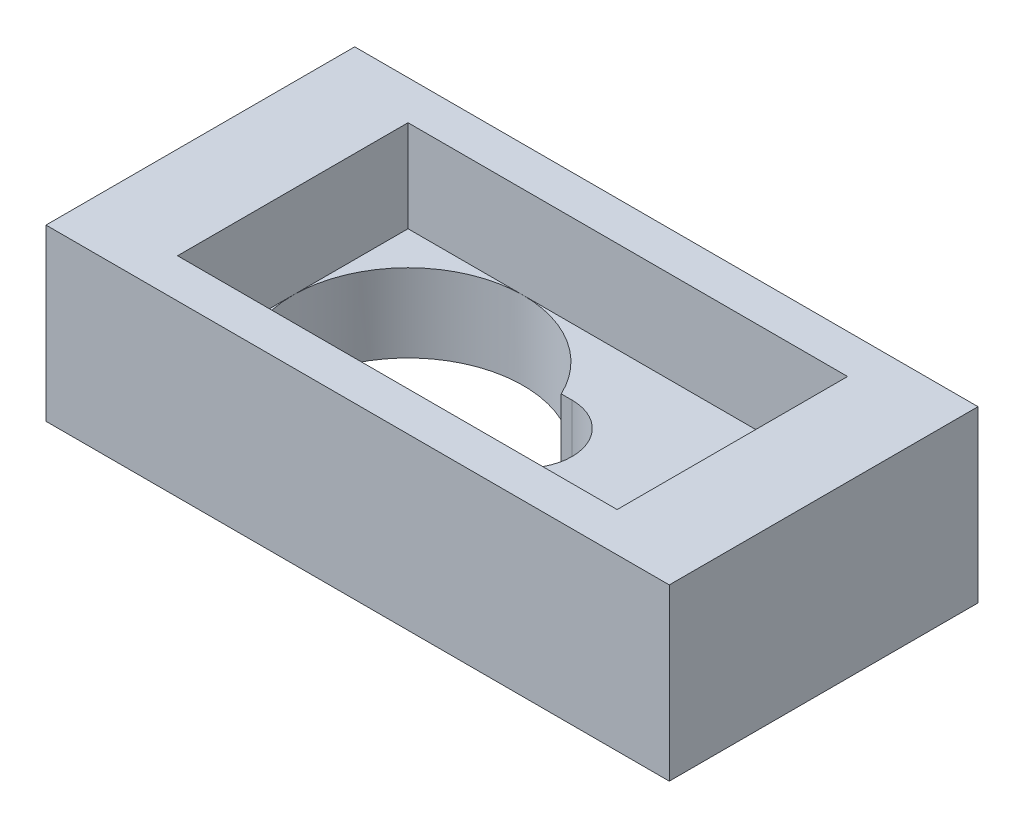
ISO-10303-21;
HEADER;
FILE_DESCRIPTION(('STEP AP214'),'2;1');
FILE_NAME('part.step','',(''),(''),'','','');
FILE_SCHEMA(('AUTOMOTIVE_DESIGN { 1 0 10303 214 1 1 1 1 }'));
ENDSEC;
DATA;
#1=APPLICATION_CONTEXT('core data for automotive mechanical design processes');
#2=APPLICATION_PROTOCOL_DEFINITION('international standard','automotive_design',2000,#1);
#3=PRODUCT_CONTEXT('',#1,'mechanical');
#4=PRODUCT('Part','Part','',(#3));
#5=PRODUCT_RELATED_PRODUCT_CATEGORY('part','',(#4));
#6=PRODUCT_DEFINITION_FORMATION('','',#4);
#7=PRODUCT_DEFINITION_CONTEXT('part definition',#1,'design');
#8=PRODUCT_DEFINITION('design','',#6,#7);
#9=PRODUCT_DEFINITION_SHAPE('','',#8);
#10=(LENGTH_UNIT() NAMED_UNIT(*) SI_UNIT(.MILLI.,.METRE.));
#11=(NAMED_UNIT(*) PLANE_ANGLE_UNIT() SI_UNIT($,.RADIAN.));
#12=(NAMED_UNIT(*) SI_UNIT($,.STERADIAN.) SOLID_ANGLE_UNIT());
#13=UNCERTAINTY_MEASURE_WITH_UNIT(LENGTH_MEASURE(1.E-05),#10,'distance_accuracy_value','');
#14=(GEOMETRIC_REPRESENTATION_CONTEXT(3) GLOBAL_UNCERTAINTY_ASSIGNED_CONTEXT((#13)) GLOBAL_UNIT_ASSIGNED_CONTEXT((#10,
#11,#12)) REPRESENTATION_CONTEXT('',''));
#15=CARTESIAN_POINT('',(0.,0.,0.));
#16=DIRECTION('',(0.,0.,1.));
#17=DIRECTION('',(1.,0.,0.));
#18=AXIS2_PLACEMENT_3D('',#15,#16,#17);
#19=CARTESIAN_POINT('',(0.,4.,0.));
#20=DIRECTION('',(0.,1.,0.));
#21=DIRECTION('',(0.,0.,1.));
#22=AXIS2_PLACEMENT_3D('',#19,#20,#21);
#23=PLANE('',#22);
#24=DIRECTION('',(0.,0.,-1.));
#25=VECTOR('',#24,1.);
#26=CARTESIAN_POINT('',(9.70427981122599,4.,5.99880623790041));
#27=LINE('',#26,#25);
#28=CARTESIAN_POINT('',(9.70427981122599,4.,5.99880623790041));
#29=VERTEX_POINT('',#28);
#30=CARTESIAN_POINT('',(9.70427981122599,4.,-5.79605424270867));
#31=VERTEX_POINT('',#30);
#32=EDGE_CURVE('E151',#29,#31,#27,.T.);
#33=ORIENTED_EDGE('',*,*,#32,.T.);
#34=DIRECTION('',(-1.,0.,0.));
#35=VECTOR('',#34,1.);
#36=CARTESIAN_POINT('',(-6.89572018877401,4.,-5.79605424270866));
#37=LINE('',#36,#35);
#38=CARTESIAN_POINT('',(-6.89572018877399,4.,-5.79605424270866));
#39=VERTEX_POINT('',#38);
#40=EDGE_CURVE('E52',#31,#39,#37,.T.);
#41=ORIENTED_EDGE('',*,*,#40,.T.);
#42=CARTESIAN_POINT('',(-6.89572018877399,4.,0.101375997595874));
#43=DIRECTION('',(0.,1.,0.));
#44=DIRECTION('',(0.,0.,1.));
#45=AXIS2_PLACEMENT_3D('',#42,#43,#44);
#46=CIRCLE('',#45,5.89743024030454);
#47=CARTESIAN_POINT('',(-1.5544016774644,4.,-2.39862400240413));
#48=VERTEX_POINT('',#47);
#49=EDGE_CURVE('E199',#48,#39,#46,.T.);
#50=ORIENTED_EDGE('',*,*,#49,.F.);
#51=DIRECTION('',(-1.,0.,0.));
#52=VECTOR('',#51,1.);
#53=CARTESIAN_POINT('',(-0.998289948469448,4.,-2.39862400240413));
#54=LINE('',#53,#52);
#55=CARTESIAN_POINT('',(-0.998289948469448,4.,-2.39862400240413));
#56=VERTEX_POINT('',#55);
#57=EDGE_CURVE('E196',#56,#48,#54,.T.);
#58=ORIENTED_EDGE('',*,*,#57,.F.);
#59=CARTESIAN_POINT('',(-0.998289948469448,4.,0.101375997595873));
#60=DIRECTION('',(0.,1.,0.));
#61=DIRECTION('',(0.,0.,1.));
#62=AXIS2_PLACEMENT_3D('',#59,#60,#61);
#63=CIRCLE('',#62,2.5);
#64=CARTESIAN_POINT('',(-0.998289948469448,4.,2.60137599759587));
#65=VERTEX_POINT('',#64);
#66=EDGE_CURVE('E194',#65,#56,#63,.T.);
#67=ORIENTED_EDGE('',*,*,#66,.F.);
#68=DIRECTION('',(1.,0.,0.));
#69=VECTOR('',#68,1.);
#70=CARTESIAN_POINT('',(-0.998289948469448,4.,2.60137599759587));
#71=LINE('',#70,#69);
#72=CARTESIAN_POINT('',(-1.5544016774644,4.,2.60137599759587));
#73=VERTEX_POINT('',#72);
#74=EDGE_CURVE('E202',#73,#65,#71,.T.);
#75=ORIENTED_EDGE('',*,*,#74,.F.);
#76=CARTESIAN_POINT('',(-6.89572018877399,4.,5.99880623790041));
#77=VERTEX_POINT('',#76);
#78=EDGE_CURVE('E66',#77,#73,#46,.T.);
#79=ORIENTED_EDGE('',*,*,#78,.F.);
#80=DIRECTION('',(1.,0.,0.));
#81=VECTOR('',#80,1.);
#82=CARTESIAN_POINT('',(-6.89572018877393,4.,5.99880623790041));
#83=LINE('',#82,#81);
#84=EDGE_CURVE('E175',#77,#29,#83,.T.);
#85=ORIENTED_EDGE('',*,*,#84,.T.);
#86=EDGE_LOOP('',(#33,#41,#50,#58,#67,#75,#79,#85));
#87=FACE_BOUND('',#86,.T.);
#88=ADVANCED_FACE('F41',(#87),#23,.T.);
#89=CARTESIAN_POINT('',(-12.7931504290785,4.,0.101375997595874));
#90=VERTEX_POINT('',#89);
#91=EDGE_CURVE('E203',#39,#90,#46,.T.);
#92=ORIENTED_EDGE('',*,*,#91,.F.);
#93=CARTESIAN_POINT('',(-12.7931504290785,4.,-5.79605424270866));
#94=VERTEX_POINT('',#93);
#95=EDGE_CURVE('E11',#39,#94,#37,.T.);
#96=ORIENTED_EDGE('',*,*,#95,.T.);
#97=DIRECTION('',(0.,0.,1.));
#98=VECTOR('',#97,1.);
#99=CARTESIAN_POINT('',(-12.7931504290785,4.,0.101375997595876));
#100=LINE('',#99,#98);
#101=EDGE_CURVE('E158',#94,#90,#100,.T.);
#102=ORIENTED_EDGE('',*,*,#101,.T.);
#103=EDGE_LOOP('',(#92,#96,#102));
#104=FACE_BOUND('',#103,.T.);
#105=ADVANCED_FACE('F258',(#104),#23,.T.);
#106=EDGE_CURVE('E254',#90,#77,#46,.T.);
#107=ORIENTED_EDGE('',*,*,#106,.F.);
#108=CARTESIAN_POINT('',(-12.7931504290785,4.,5.99880623790041));
#109=VERTEX_POINT('',#108);
#110=EDGE_CURVE('E50',#90,#109,#100,.T.);
#111=ORIENTED_EDGE('',*,*,#110,.T.);
#112=EDGE_CURVE('E172',#109,#77,#83,.T.);
#113=ORIENTED_EDGE('',*,*,#112,.T.);
#114=EDGE_LOOP('',(#107,#111,#113));
#115=FACE_BOUND('',#114,.T.);
#116=ADVANCED_FACE('F253',(#115),#23,.T.);
#117=CARTESIAN_POINT('',(0.,0.,0.));
#118=DIRECTION('',(0.,1.,0.));
#119=DIRECTION('',(0.,0.,1.));
#120=AXIS2_PLACEMENT_3D('',#117,#118,#119);
#121=PLANE('',#120);
#122=DIRECTION('',(0.,0.,-1.));
#123=VECTOR('',#122,1.);
#124=CARTESIAN_POINT('',(14.378787795047,0.,-5.79605424270866));
#125=LINE('',#124,#123);
#126=CARTESIAN_POINT('',(14.378787795047,0.,8.00394575729134));
#127=VERTEX_POINT('',#126);
#128=CARTESIAN_POINT('',(14.378787795047,0.,-7.79605424270866));
#129=VERTEX_POINT('',#128);
#130=EDGE_CURVE('E225',#127,#129,#125,.T.);
#131=ORIENTED_EDGE('',*,*,#130,.F.);
#132=DIRECTION('',(1.,0.,0.));
#133=VECTOR('',#132,1.);
#134=CARTESIAN_POINT('',(-17.521212204953,0.,8.00394575729134));
#135=LINE('',#134,#133);
#136=CARTESIAN_POINT('',(-17.521212204953,0.,8.00394575729134));
#137=VERTEX_POINT('',#136);
#138=EDGE_CURVE('E232',#137,#127,#135,.T.);
#139=ORIENTED_EDGE('',*,*,#138,.F.);
#140=DIRECTION('',(0.,0.,1.));
#141=VECTOR('',#140,1.);
#142=CARTESIAN_POINT('',(-17.521212204953,0.,6.00394575729134));
#143=LINE('',#142,#141);
#144=CARTESIAN_POINT('',(-17.521212204953,0.,-7.79605424270866));
#145=VERTEX_POINT('',#144);
#146=EDGE_CURVE('E230',#145,#137,#143,.T.);
#147=ORIENTED_EDGE('',*,*,#146,.F.);
#148=DIRECTION('',(-1.,0.,0.));
#149=VECTOR('',#148,1.);
#150=CARTESIAN_POINT('',(-17.521212204953,0.,-7.79605424270866));
#151=LINE('',#150,#149);
#152=EDGE_CURVE('E227',#129,#145,#151,.T.);
#153=ORIENTED_EDGE('',*,*,#152,.F.);
#154=EDGE_LOOP('',(#131,#139,#147,#153));
#155=FACE_BOUND('',#154,.T.);
#156=CARTESIAN_POINT('',(-0.998289948469448,0.,0.101375997595873));
#157=DIRECTION('',(0.,1.,0.));
#158=DIRECTION('',(0.,0.,1.));
#159=AXIS2_PLACEMENT_3D('',#156,#157,#158);
#160=CIRCLE('',#159,2.5);
#161=CARTESIAN_POINT('',(-0.998289948469448,0.,2.60137599759587));
#162=VERTEX_POINT('',#161);
#163=CARTESIAN_POINT('',(-0.998289948469448,0.,-2.39862400240413));
#164=VERTEX_POINT('',#163);
#165=EDGE_CURVE('E193',#162,#164,#160,.T.);
#166=ORIENTED_EDGE('',*,*,#165,.T.);
#167=DIRECTION('',(-1.,0.,0.));
#168=VECTOR('',#167,1.);
#169=CARTESIAN_POINT('',(-0.998289948469448,0.,-2.39862400240413));
#170=LINE('',#169,#168);
#171=CARTESIAN_POINT('',(-1.5544016774644,0.,-2.39862400240413));
#172=VERTEX_POINT('',#171);
#173=EDGE_CURVE('E208',#164,#172,#170,.T.);
#174=ORIENTED_EDGE('',*,*,#173,.T.);
#175=CARTESIAN_POINT('',(-6.89572018877399,0.,0.101375997595874));
#176=DIRECTION('',(0.,1.,0.));
#177=DIRECTION('',(0.,0.,1.));
#178=AXIS2_PLACEMENT_3D('',#175,#176,#177);
#179=CIRCLE('',#178,5.89743024030454);
#180=CARTESIAN_POINT('',(-1.5544016774644,0.,2.60137599759587));
#181=VERTEX_POINT('',#180);
#182=EDGE_CURVE('E211',#172,#181,#179,.T.);
#183=ORIENTED_EDGE('',*,*,#182,.T.);
#184=DIRECTION('',(1.,0.,0.));
#185=VECTOR('',#184,1.);
#186=CARTESIAN_POINT('',(-0.998289948469448,0.,2.60137599759587));
#187=LINE('',#186,#185);
#188=EDGE_CURVE('E197',#181,#162,#187,.T.);
#189=ORIENTED_EDGE('',*,*,#188,.T.);
#190=EDGE_LOOP('',(#166,#174,#183,#189));
#191=FACE_BOUND('',#190,.T.);
#192=ADVANCED_FACE('F282',(#155,#191),#121,.F.);
#193=CARTESIAN_POINT('',(14.378787795047,4.,-5.79605424270866));
#194=DIRECTION('',(-1.,0.,0.));
#195=DIRECTION('',(0.,0.,1.));
#196=AXIS2_PLACEMENT_3D('',#193,#194,#195);
#197=PLANE('',#196);
#198=ORIENTED_EDGE('',*,*,#130,.T.);
#199=DIRECTION('',(0.,-1.,0.));
#200=VECTOR('',#199,1.);
#201=CARTESIAN_POINT('',(14.378787795047,4.,-7.79605424270866));
#202=LINE('',#201,#200);
#203=CARTESIAN_POINT('',(14.378787795047,8.7,-7.79605424270866));
#204=VERTEX_POINT('',#203);
#205=EDGE_CURVE('E45',#204,#129,#202,.T.);
#206=ORIENTED_EDGE('',*,*,#205,.F.);
#207=DIRECTION('',(0.,0.,-1.));
#208=VECTOR('',#207,1.);
#209=CARTESIAN_POINT('',(14.378787795047,8.7,-7.79605424270866));
#210=LINE('',#209,#208);
#211=CARTESIAN_POINT('',(14.378787795047,8.7,8.00394575729134));
#212=VERTEX_POINT('',#211);
#213=EDGE_CURVE('E187',#212,#204,#210,.T.);
#214=ORIENTED_EDGE('',*,*,#213,.F.);
#215=DIRECTION('',(0.,-1.,0.));
#216=VECTOR('',#215,1.);
#217=CARTESIAN_POINT('',(14.378787795047,4.,8.00394575729134));
#218=LINE('',#217,#216);
#219=EDGE_CURVE('E235',#212,#127,#218,.T.);
#220=ORIENTED_EDGE('',*,*,#219,.T.);
#221=EDGE_LOOP('',(#198,#206,#214,#220));
#222=FACE_BOUND('',#221,.T.);
#223=ADVANCED_FACE('F43',(#222),#197,.F.);
#224=CARTESIAN_POINT('',(-17.521212204953,4.,-7.79605424270866));
#225=DIRECTION('',(0.,0.,1.));
#226=DIRECTION('',(1.,0.,0.));
#227=AXIS2_PLACEMENT_3D('',#224,#225,#226);
#228=PLANE('',#227);
#229=ORIENTED_EDGE('',*,*,#152,.T.);
#230=DIRECTION('',(0.,-1.,0.));
#231=VECTOR('',#230,1.);
#232=CARTESIAN_POINT('',(-17.521212204953,4.,-7.79605424270866));
#233=LINE('',#232,#231);
#234=CARTESIAN_POINT('',(-17.521212204953,8.7,-7.79605424270866));
#235=VERTEX_POINT('',#234);
#236=EDGE_CURVE('E240',#235,#145,#233,.T.);
#237=ORIENTED_EDGE('',*,*,#236,.F.);
#238=DIRECTION('',(-1.,0.,0.));
#239=VECTOR('',#238,1.);
#240=CARTESIAN_POINT('',(-17.521212204953,8.7,-7.79605424270866));
#241=LINE('',#240,#239);
#242=EDGE_CURVE('E190',#204,#235,#241,.T.);
#243=ORIENTED_EDGE('',*,*,#242,.F.);
#244=ORIENTED_EDGE('',*,*,#205,.T.);
#245=EDGE_LOOP('',(#229,#237,#243,#244));
#246=FACE_BOUND('',#245,.T.);
#247=ADVANCED_FACE('F290',(#246),#228,.F.);
#248=CARTESIAN_POINT('',(-17.521212204953,4.,6.00394575729134));
#249=DIRECTION('',(1.,0.,0.));
#250=DIRECTION('',(0.,0.,-1.));
#251=AXIS2_PLACEMENT_3D('',#248,#249,#250);
#252=PLANE('',#251);
#253=ORIENTED_EDGE('',*,*,#146,.T.);
#254=DIRECTION('',(0.,-1.,0.));
#255=VECTOR('',#254,1.);
#256=CARTESIAN_POINT('',(-17.521212204953,4.,8.00394575729134));
#257=LINE('',#256,#255);
#258=CARTESIAN_POINT('',(-17.521212204953,8.7,8.00394575729134));
#259=VERTEX_POINT('',#258);
#260=EDGE_CURVE('E238',#259,#137,#257,.T.);
#261=ORIENTED_EDGE('',*,*,#260,.F.);
#262=DIRECTION('',(0.,0.,1.));
#263=VECTOR('',#262,1.);
#264=CARTESIAN_POINT('',(-17.521212204953,8.7,-7.79605424270866));
#265=LINE('',#264,#263);
#266=EDGE_CURVE('E159',#235,#259,#265,.T.);
#267=ORIENTED_EDGE('',*,*,#266,.F.);
#268=ORIENTED_EDGE('',*,*,#236,.T.);
#269=EDGE_LOOP('',(#253,#261,#267,#268));
#270=FACE_BOUND('',#269,.T.);
#271=ADVANCED_FACE('F298',(#270),#252,.F.);
#272=CARTESIAN_POINT('',(-17.521212204953,4.,8.00394575729134));
#273=DIRECTION('',(0.,0.,-1.));
#274=DIRECTION('',(-1.,0.,0.));
#275=AXIS2_PLACEMENT_3D('',#272,#273,#274);
#276=PLANE('',#275);
#277=ORIENTED_EDGE('',*,*,#138,.T.);
#278=ORIENTED_EDGE('',*,*,#219,.F.);
#279=DIRECTION('',(1.,0.,0.));
#280=VECTOR('',#279,1.);
#281=CARTESIAN_POINT('',(-17.521212204953,8.7,8.00394575729134));
#282=LINE('',#281,#280);
#283=EDGE_CURVE('E184',#259,#212,#282,.T.);
#284=ORIENTED_EDGE('',*,*,#283,.F.);
#285=ORIENTED_EDGE('',*,*,#260,.T.);
#286=EDGE_LOOP('',(#277,#278,#284,#285));
#287=FACE_BOUND('',#286,.T.);
#288=ADVANCED_FACE('F294',(#287),#276,.F.);
#289=CARTESIAN_POINT('',(-0.998289948469448,4.,0.101375997595873));
#290=DIRECTION('',(0.,-1.,0.));
#291=DIRECTION('',(0.,0.,-1.));
#292=AXIS2_PLACEMENT_3D('',#289,#290,#291);
#293=CYLINDRICAL_SURFACE('',#292,2.5);
#294=ORIENTED_EDGE('',*,*,#165,.F.);
#295=DIRECTION('',(0.,-1.,0.));
#296=VECTOR('',#295,1.);
#297=CARTESIAN_POINT('',(-0.998289948469448,4.,2.60137599759587));
#298=LINE('',#297,#296);
#299=EDGE_CURVE('E205',#65,#162,#298,.T.);
#300=ORIENTED_EDGE('',*,*,#299,.F.);
#301=ORIENTED_EDGE('',*,*,#66,.T.);
#302=DIRECTION('',(0.,-1.,0.));
#303=VECTOR('',#302,1.);
#304=CARTESIAN_POINT('',(-0.998289948469448,4.,-2.39862400240413));
#305=LINE('',#304,#303);
#306=EDGE_CURVE('E222',#56,#164,#305,.T.);
#307=ORIENTED_EDGE('',*,*,#306,.T.);
#308=EDGE_LOOP('',(#294,#300,#301,#307));
#309=FACE_BOUND('',#308,.T.);
#310=ADVANCED_FACE('F297',(#309),#293,.F.);
#311=CARTESIAN_POINT('',(-0.998289948469448,4.,-2.39862400240413));
#312=DIRECTION('',(0.,0.,1.));
#313=DIRECTION('',(1.,0.,0.));
#314=AXIS2_PLACEMENT_3D('',#311,#312,#313);
#315=PLANE('',#314);
#316=ORIENTED_EDGE('',*,*,#173,.F.);
#317=ORIENTED_EDGE('',*,*,#306,.F.);
#318=ORIENTED_EDGE('',*,*,#57,.T.);
#319=DIRECTION('',(0.,-1.,0.));
#320=VECTOR('',#319,1.);
#321=CARTESIAN_POINT('',(-1.5544016774644,4.,-2.39862400240413));
#322=LINE('',#321,#320);
#323=EDGE_CURVE('E220',#48,#172,#322,.T.);
#324=ORIENTED_EDGE('',*,*,#323,.T.);
#325=EDGE_LOOP('',(#316,#317,#318,#324));
#326=FACE_BOUND('',#325,.T.);
#327=ADVANCED_FACE('F322',(#326),#315,.T.);
#328=CARTESIAN_POINT('',(-6.89572018877399,4.,0.101375997595874));
#329=DIRECTION('',(0.,-1.,0.));
#330=DIRECTION('',(0.,0.,-1.));
#331=AXIS2_PLACEMENT_3D('',#328,#329,#330);
#332=CYLINDRICAL_SURFACE('',#331,5.89743024030454);
#333=ORIENTED_EDGE('',*,*,#182,.F.);
#334=ORIENTED_EDGE('',*,*,#323,.F.);
#335=ORIENTED_EDGE('',*,*,#49,.T.);
#336=ORIENTED_EDGE('',*,*,#91,.T.);
#337=ORIENTED_EDGE('',*,*,#106,.T.);
#338=ORIENTED_EDGE('',*,*,#78,.T.);
#339=DIRECTION('',(0.,-1.,0.));
#340=VECTOR('',#339,1.);
#341=CARTESIAN_POINT('',(-1.5544016774644,4.,2.60137599759587));
#342=LINE('',#341,#340);
#343=EDGE_CURVE('E218',#73,#181,#342,.T.);
#344=ORIENTED_EDGE('',*,*,#343,.T.);
#345=EDGE_LOOP('',(#333,#334,#335,#336,#337,#338,#344));
#346=FACE_BOUND('',#345,.T.);
#347=ADVANCED_FACE('F316',(#346),#332,.F.);
#348=CARTESIAN_POINT('',(-0.998289948469448,4.,2.60137599759587));
#349=DIRECTION('',(0.,0.,-1.));
#350=DIRECTION('',(-1.,0.,0.));
#351=AXIS2_PLACEMENT_3D('',#348,#349,#350);
#352=PLANE('',#351);
#353=ORIENTED_EDGE('',*,*,#188,.F.);
#354=ORIENTED_EDGE('',*,*,#343,.F.);
#355=ORIENTED_EDGE('',*,*,#74,.T.);
#356=ORIENTED_EDGE('',*,*,#299,.T.);
#357=EDGE_LOOP('',(#353,#354,#355,#356));
#358=FACE_BOUND('',#357,.T.);
#359=ADVANCED_FACE('F309',(#358),#352,.T.);
#360=CARTESIAN_POINT('',(0.,8.7,0.));
#361=DIRECTION('',(0.,1.,0.));
#362=DIRECTION('',(0.,0.,1.));
#363=AXIS2_PLACEMENT_3D('',#360,#361,#362);
#364=PLANE('',#363);
#365=ORIENTED_EDGE('',*,*,#266,.T.);
#366=ORIENTED_EDGE('',*,*,#283,.T.);
#367=ORIENTED_EDGE('',*,*,#213,.T.);
#368=ORIENTED_EDGE('',*,*,#242,.T.);
#369=EDGE_LOOP('',(#365,#366,#367,#368));
#370=FACE_BOUND('',#369,.T.);
#371=DIRECTION('',(0.,0.,1.));
#372=VECTOR('',#371,1.);
#373=CARTESIAN_POINT('',(-12.7931504290785,8.7,-5.79605424270866));
#374=LINE('',#373,#372);
#375=CARTESIAN_POINT('',(-12.7931504290785,8.7,-5.79605424270866));
#376=VERTEX_POINT('',#375);
#377=CARTESIAN_POINT('',(-12.7931504290785,8.7,5.99880623790041));
#378=VERTEX_POINT('',#377);
#379=EDGE_CURVE('E150',#376,#378,#374,.T.);
#380=ORIENTED_EDGE('',*,*,#379,.F.);
#381=DIRECTION('',(-1.,0.,0.));
#382=VECTOR('',#381,1.);
#383=CARTESIAN_POINT('',(9.70427981122599,8.7,-5.79605424270867));
#384=LINE('',#383,#382);
#385=CARTESIAN_POINT('',(9.70427981122599,8.7,-5.79605424270867));
#386=VERTEX_POINT('',#385);
#387=EDGE_CURVE('E142',#386,#376,#384,.T.);
#388=ORIENTED_EDGE('',*,*,#387,.F.);
#389=DIRECTION('',(0.,0.,-1.));
#390=VECTOR('',#389,1.);
#391=CARTESIAN_POINT('',(9.70427981122599,8.7,5.99880623790041));
#392=LINE('',#391,#390);
#393=CARTESIAN_POINT('',(9.70427981122599,8.7,5.99880623790041));
#394=VERTEX_POINT('',#393);
#395=EDGE_CURVE('E167',#394,#386,#392,.T.);
#396=ORIENTED_EDGE('',*,*,#395,.F.);
#397=DIRECTION('',(1.,0.,0.));
#398=VECTOR('',#397,1.);
#399=CARTESIAN_POINT('',(-12.7931504290785,8.7,5.99880623790041));
#400=LINE('',#399,#398);
#401=EDGE_CURVE('E165',#378,#394,#400,.T.);
#402=ORIENTED_EDGE('',*,*,#401,.F.);
#403=EDGE_LOOP('',(#380,#388,#396,#402));
#404=FACE_BOUND('',#403,.T.);
#405=ADVANCED_FACE('F163',(#370,#404),#364,.T.);
#406=CARTESIAN_POINT('',(-6.89572018877401,8.7,-5.79605424270866));
#407=DIRECTION('',(0.,0.,1.));
#408=DIRECTION('',(1.,0.,0.));
#409=AXIS2_PLACEMENT_3D('',#406,#407,#408);
#410=PLANE('',#409);
#411=ORIENTED_EDGE('',*,*,#40,.F.);
#412=DIRECTION('',(0.,-1.,0.));
#413=VECTOR('',#412,1.);
#414=CARTESIAN_POINT('',(9.70427981122599,8.7,-5.79605424270867));
#415=LINE('',#414,#413);
#416=EDGE_CURVE('E146',#386,#31,#415,.T.);
#417=ORIENTED_EDGE('',*,*,#416,.F.);
#418=ORIENTED_EDGE('',*,*,#387,.T.);
#419=DIRECTION('',(0.,-1.,0.));
#420=VECTOR('',#419,1.);
#421=CARTESIAN_POINT('',(-12.7931504290785,8.7,-5.79605424270866));
#422=LINE('',#421,#420);
#423=EDGE_CURVE('E145',#376,#94,#422,.T.);
#424=ORIENTED_EDGE('',*,*,#423,.T.);
#425=ORIENTED_EDGE('',*,*,#95,.F.);
#426=EDGE_LOOP('',(#411,#417,#418,#424,#425));
#427=FACE_BOUND('',#426,.T.);
#428=ADVANCED_FACE('F144',(#427),#410,.T.);
#429=CARTESIAN_POINT('',(-12.7931504290785,8.7,0.101375997595876));
#430=DIRECTION('',(1.,0.,0.));
#431=DIRECTION('',(0.,0.,-1.));
#432=AXIS2_PLACEMENT_3D('',#429,#430,#431);
#433=PLANE('',#432);
#434=ORIENTED_EDGE('',*,*,#101,.F.);
#435=ORIENTED_EDGE('',*,*,#423,.F.);
#436=ORIENTED_EDGE('',*,*,#379,.T.);
#437=DIRECTION('',(0.,-1.,0.));
#438=VECTOR('',#437,1.);
#439=CARTESIAN_POINT('',(-12.7931504290785,8.7,5.99880623790041));
#440=LINE('',#439,#438);
#441=EDGE_CURVE('E160',#378,#109,#440,.T.);
#442=ORIENTED_EDGE('',*,*,#441,.T.);
#443=ORIENTED_EDGE('',*,*,#110,.F.);
#444=EDGE_LOOP('',(#434,#435,#436,#442,#443));
#445=FACE_BOUND('',#444,.T.);
#446=ADVANCED_FACE('F154',(#445),#433,.T.);
#447=CARTESIAN_POINT('',(-6.89572018877393,8.7,5.99880623790041));
#448=DIRECTION('',(0.,0.,-1.));
#449=DIRECTION('',(-1.,0.,0.));
#450=AXIS2_PLACEMENT_3D('',#447,#448,#449);
#451=PLANE('',#450);
#452=ORIENTED_EDGE('',*,*,#112,.F.);
#453=ORIENTED_EDGE('',*,*,#441,.F.);
#454=ORIENTED_EDGE('',*,*,#401,.T.);
#455=DIRECTION('',(0.,-1.,0.));
#456=VECTOR('',#455,1.);
#457=CARTESIAN_POINT('',(9.70427981122599,8.7,5.99880623790041));
#458=LINE('',#457,#456);
#459=EDGE_CURVE('E179',#394,#29,#458,.T.);
#460=ORIENTED_EDGE('',*,*,#459,.T.);
#461=ORIENTED_EDGE('',*,*,#84,.F.);
#462=EDGE_LOOP('',(#452,#453,#454,#460,#461));
#463=FACE_BOUND('',#462,.T.);
#464=ADVANCED_FACE('F265',(#463),#451,.T.);
#465=CARTESIAN_POINT('',(9.70427981122599,8.7,5.99880623790041));
#466=DIRECTION('',(-1.,0.,0.));
#467=DIRECTION('',(0.,0.,1.));
#468=AXIS2_PLACEMENT_3D('',#465,#466,#467);
#469=PLANE('',#468);
#470=ORIENTED_EDGE('',*,*,#32,.F.);
#471=ORIENTED_EDGE('',*,*,#459,.F.);
#472=ORIENTED_EDGE('',*,*,#395,.T.);
#473=ORIENTED_EDGE('',*,*,#416,.T.);
#474=EDGE_LOOP('',(#470,#471,#472,#473));
#475=FACE_BOUND('',#474,.T.);
#476=ADVANCED_FACE('F263',(#475),#469,.T.);
#477=CLOSED_SHELL('',(#88,#105,#116,#192,#223,#247,#271,#288,#310,#327,#347,#359,#405,#428,#446,
#464,#476));
#478=MANIFOLD_SOLID_BREP('B2',#477);
#479=ADVANCED_BREP_SHAPE_REPRESENTATION('',(#18,#478),#14);
#480=SHAPE_DEFINITION_REPRESENTATION(#9,#479);
ENDSEC;
END-ISO-10303-21;
